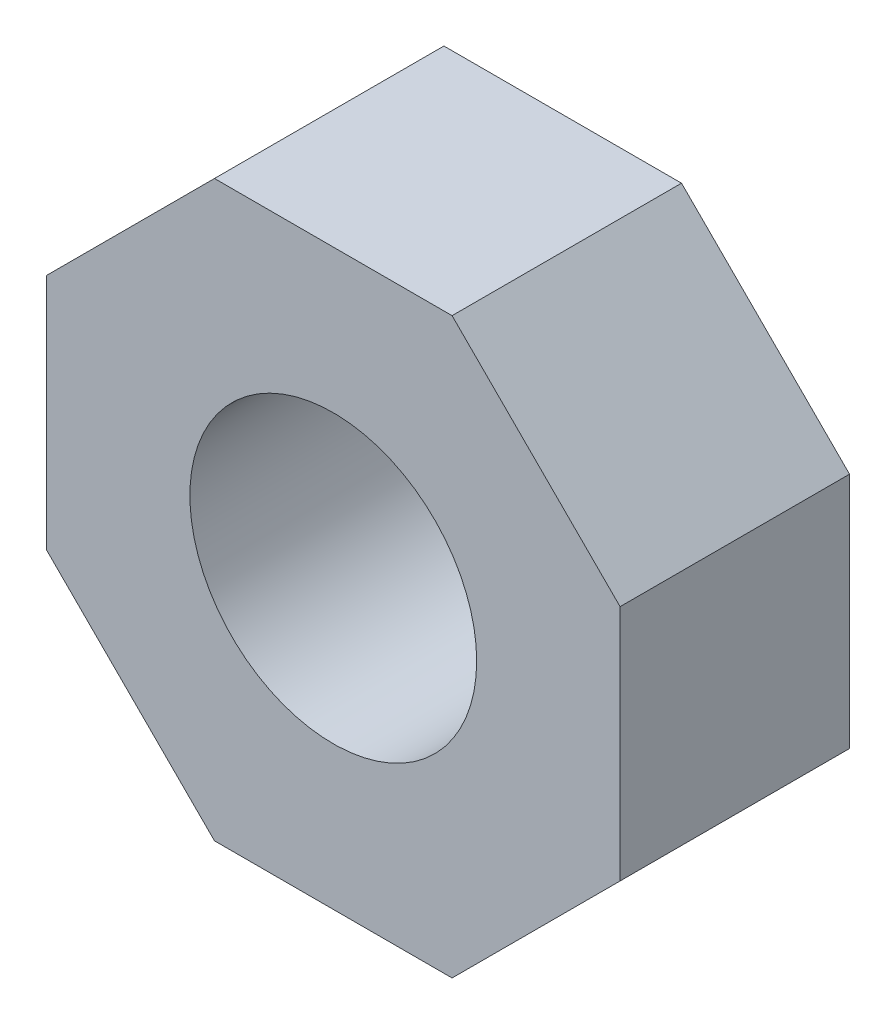
ISO-10303-21;
HEADER;
FILE_DESCRIPTION(('STEP AP214'),'2;1');
FILE_NAME('part.step','',(''),(''),'','','');
FILE_SCHEMA(('AUTOMOTIVE_DESIGN { 1 0 10303 214 1 1 1 1 }'));
ENDSEC;
DATA;
#1=APPLICATION_CONTEXT('core data for automotive mechanical design processes');
#2=APPLICATION_PROTOCOL_DEFINITION('international standard','automotive_design',2000,#1);
#3=PRODUCT_CONTEXT('',#1,'mechanical');
#4=PRODUCT('Part','Part','',(#3));
#5=PRODUCT_RELATED_PRODUCT_CATEGORY('part','',(#4));
#6=PRODUCT_DEFINITION_FORMATION('','',#4);
#7=PRODUCT_DEFINITION_CONTEXT('part definition',#1,'design');
#8=PRODUCT_DEFINITION('design','',#6,#7);
#9=PRODUCT_DEFINITION_SHAPE('','',#8);
#10=(LENGTH_UNIT() NAMED_UNIT(*) SI_UNIT(.MILLI.,.METRE.));
#11=(NAMED_UNIT(*) PLANE_ANGLE_UNIT() SI_UNIT($,.RADIAN.));
#12=(NAMED_UNIT(*) SI_UNIT($,.STERADIAN.) SOLID_ANGLE_UNIT());
#13=UNCERTAINTY_MEASURE_WITH_UNIT(LENGTH_MEASURE(1.E-05),#10,'distance_accuracy_value','');
#14=(GEOMETRIC_REPRESENTATION_CONTEXT(3) GLOBAL_UNCERTAINTY_ASSIGNED_CONTEXT((#13)) GLOBAL_UNIT_ASSIGNED_CONTEXT((#10,
#11,#12)) REPRESENTATION_CONTEXT('',''));
#15=CARTESIAN_POINT('',(0.,0.,0.));
#16=DIRECTION('',(0.,0.,1.));
#17=DIRECTION('',(1.,0.,0.));
#18=AXIS2_PLACEMENT_3D('',#15,#16,#17);
#19=CARTESIAN_POINT('',(-3.53553390593274,3.53553390593273,4.));
#20=DIRECTION('',(-0.707106781186549,0.707106781186546,0.));
#21=DIRECTION('',(-0.707106781186546,-0.707106781186549,0.));
#22=AXIS2_PLACEMENT_3D('',#19,#20,#21);
#23=PLANE('',#22);
#24=DIRECTION('',(0.707106781186546,0.707106781186549,0.));
#25=VECTOR('',#24,1.);
#26=CARTESIAN_POINT('',(-3.53553390593274,3.53553390593273,0.));
#27=LINE('',#26,#25);
#28=CARTESIAN_POINT('',(-4.99999999999999,2.07106781186546,0.));
#29=VERTEX_POINT('',#28);
#30=CARTESIAN_POINT('',(-2.07106781186548,5.,0.));
#31=VERTEX_POINT('',#30);
#32=EDGE_CURVE('E136',#29,#31,#27,.T.);
#33=ORIENTED_EDGE('',*,*,#32,.F.);
#34=DIRECTION('',(0.,0.,-1.));
#35=VECTOR('',#34,1.);
#36=CARTESIAN_POINT('',(-4.99999999999999,2.07106781186546,4.));
#37=LINE('',#36,#35);
#38=CARTESIAN_POINT('',(-4.99999999999999,2.07106781186546,4.));
#39=VERTEX_POINT('',#38);
#40=EDGE_CURVE('E11',#39,#29,#37,.T.);
#41=ORIENTED_EDGE('',*,*,#40,.F.);
#42=DIRECTION('',(0.707106781186546,0.707106781186549,0.));
#43=VECTOR('',#42,1.);
#44=CARTESIAN_POINT('',(-3.53553390593274,3.53553390593273,4.));
#45=LINE('',#44,#43);
#46=CARTESIAN_POINT('',(-2.07106781186548,5.,4.));
#47=VERTEX_POINT('',#46);
#48=EDGE_CURVE('E185',#39,#47,#45,.T.);
#49=ORIENTED_EDGE('',*,*,#48,.T.);
#50=DIRECTION('',(0.,0.,-1.));
#51=VECTOR('',#50,1.);
#52=CARTESIAN_POINT('',(-2.07106781186548,5.,4.));
#53=LINE('',#52,#51);
#54=EDGE_CURVE('E56',#47,#31,#53,.T.);
#55=ORIENTED_EDGE('',*,*,#54,.T.);
#56=EDGE_LOOP('',(#33,#41,#49,#55));
#57=FACE_BOUND('',#56,.T.);
#58=ADVANCED_FACE('F39',(#57),#23,.T.);
#59=CARTESIAN_POINT('',(-5.,0.,4.));
#60=DIRECTION('',(1.,0.,0.));
#61=DIRECTION('',(0.,1.,0.));
#62=AXIS2_PLACEMENT_3D('',#59,#60,#61);
#63=PLANE('',#62);
#64=DIRECTION('',(0.,-1.,0.));
#65=VECTOR('',#64,1.);
#66=CARTESIAN_POINT('',(-5.,0.,0.));
#67=LINE('',#66,#65);
#68=CARTESIAN_POINT('',(-4.99999999999999,-2.0710678118655,0.));
#69=VERTEX_POINT('',#68);
#70=EDGE_CURVE('E138',#29,#69,#67,.T.);
#71=ORIENTED_EDGE('',*,*,#70,.T.);
#72=DIRECTION('',(0.,0.,-1.));
#73=VECTOR('',#72,1.);
#74=CARTESIAN_POINT('',(-4.99999999999999,-2.0710678118655,4.));
#75=LINE('',#74,#73);
#76=CARTESIAN_POINT('',(-4.99999999999999,-2.0710678118655,4.));
#77=VERTEX_POINT('',#76);
#78=EDGE_CURVE('E48',#77,#69,#75,.T.);
#79=ORIENTED_EDGE('',*,*,#78,.F.);
#80=DIRECTION('',(0.,-1.,0.));
#81=VECTOR('',#80,1.);
#82=CARTESIAN_POINT('',(-5.,0.,4.));
#83=LINE('',#82,#81);
#84=EDGE_CURVE('E183',#39,#77,#83,.T.);
#85=ORIENTED_EDGE('',*,*,#84,.F.);
#86=ORIENTED_EDGE('',*,*,#40,.T.);
#87=EDGE_LOOP('',(#71,#79,#85,#86));
#88=FACE_BOUND('',#87,.T.);
#89=ADVANCED_FACE('F172',(#88),#63,.F.);
#90=CARTESIAN_POINT('',(-3.53553390593272,-3.53553390593276,4.));
#91=DIRECTION('',(-0.707106781186544,-0.707106781186551,0.));
#92=DIRECTION('',(0.707106781186551,-0.707106781186544,0.));
#93=AXIS2_PLACEMENT_3D('',#90,#91,#92);
#94=PLANE('',#93);
#95=DIRECTION('',(-0.707106781186551,0.707106781186544,0.));
#96=VECTOR('',#95,1.);
#97=CARTESIAN_POINT('',(-3.53553390593272,-3.53553390593276,0.));
#98=LINE('',#97,#96);
#99=CARTESIAN_POINT('',(-2.07106781186544,-5.,0.));
#100=VERTEX_POINT('',#99);
#101=EDGE_CURVE('E141',#100,#69,#98,.T.);
#102=ORIENTED_EDGE('',*,*,#101,.F.);
#103=DIRECTION('',(0.,0.,-1.));
#104=VECTOR('',#103,1.);
#105=CARTESIAN_POINT('',(-2.07106781186544,-5.,4.));
#106=LINE('',#105,#104);
#107=CARTESIAN_POINT('',(-2.07106781186544,-5.,4.));
#108=VERTEX_POINT('',#107);
#109=EDGE_CURVE('E162',#108,#100,#106,.T.);
#110=ORIENTED_EDGE('',*,*,#109,.F.);
#111=DIRECTION('',(-0.707106781186551,0.707106781186544,0.));
#112=VECTOR('',#111,1.);
#113=CARTESIAN_POINT('',(-3.53553390593272,-3.53553390593276,4.));
#114=LINE('',#113,#112);
#115=EDGE_CURVE('E169',#108,#77,#114,.T.);
#116=ORIENTED_EDGE('',*,*,#115,.T.);
#117=ORIENTED_EDGE('',*,*,#78,.T.);
#118=EDGE_LOOP('',(#102,#110,#116,#117));
#119=FACE_BOUND('',#118,.T.);
#120=ADVANCED_FACE('F167',(#119),#94,.T.);
#121=CARTESIAN_POINT('',(0.,-5.,4.));
#122=DIRECTION('',(0.,1.,0.));
#123=DIRECTION('',(-1.,0.,0.));
#124=AXIS2_PLACEMENT_3D('',#121,#122,#123);
#125=PLANE('',#124);
#126=DIRECTION('',(1.,0.,0.));
#127=VECTOR('',#126,1.);
#128=CARTESIAN_POINT('',(0.,-5.,0.));
#129=LINE('',#128,#127);
#130=CARTESIAN_POINT('',(2.07106781186548,-5.,0.));
#131=VERTEX_POINT('',#130);
#132=EDGE_CURVE('E144',#100,#131,#129,.T.);
#133=ORIENTED_EDGE('',*,*,#132,.T.);
#134=DIRECTION('',(0.,0.,-1.));
#135=VECTOR('',#134,1.);
#136=CARTESIAN_POINT('',(2.07106781186548,-5.,4.));
#137=LINE('',#136,#135);
#138=CARTESIAN_POINT('',(2.07106781186548,-5.,4.));
#139=VERTEX_POINT('',#138);
#140=EDGE_CURVE('E160',#139,#131,#137,.T.);
#141=ORIENTED_EDGE('',*,*,#140,.F.);
#142=DIRECTION('',(1.,0.,0.));
#143=VECTOR('',#142,1.);
#144=CARTESIAN_POINT('',(0.,-5.,4.));
#145=LINE('',#144,#143);
#146=EDGE_CURVE('E181',#108,#139,#145,.T.);
#147=ORIENTED_EDGE('',*,*,#146,.F.);
#148=ORIENTED_EDGE('',*,*,#109,.T.);
#149=EDGE_LOOP('',(#133,#141,#147,#148));
#150=FACE_BOUND('',#149,.T.);
#151=ADVANCED_FACE('F179',(#150),#125,.F.);
#152=CARTESIAN_POINT('',(3.53553390593274,-3.53553390593274,4.));
#153=DIRECTION('',(0.707106781186548,-0.707106781186547,0.));
#154=DIRECTION('',(0.707106781186547,0.707106781186548,0.));
#155=AXIS2_PLACEMENT_3D('',#152,#153,#154);
#156=PLANE('',#155);
#157=DIRECTION('',(-0.707106781186547,-0.707106781186548,0.));
#158=VECTOR('',#157,1.);
#159=CARTESIAN_POINT('',(3.53553390593274,-3.53553390593274,0.));
#160=LINE('',#159,#158);
#161=CARTESIAN_POINT('',(5.00000000000001,-2.07106781186546,0.));
#162=VERTEX_POINT('',#161);
#163=EDGE_CURVE('E147',#162,#131,#160,.T.);
#164=ORIENTED_EDGE('',*,*,#163,.F.);
#165=DIRECTION('',(0.,0.,-1.));
#166=VECTOR('',#165,1.);
#167=CARTESIAN_POINT('',(5.00000000000001,-2.07106781186546,4.));
#168=LINE('',#167,#166);
#169=CARTESIAN_POINT('',(5.00000000000001,-2.07106781186546,4.));
#170=VERTEX_POINT('',#169);
#171=EDGE_CURVE('E115',#170,#162,#168,.T.);
#172=ORIENTED_EDGE('',*,*,#171,.F.);
#173=DIRECTION('',(-0.707106781186547,-0.707106781186548,0.));
#174=VECTOR('',#173,1.);
#175=CARTESIAN_POINT('',(3.53553390593274,-3.53553390593274,4.));
#176=LINE('',#175,#174);
#177=EDGE_CURVE('E125',#170,#139,#176,.T.);
#178=ORIENTED_EDGE('',*,*,#177,.T.);
#179=ORIENTED_EDGE('',*,*,#140,.T.);
#180=EDGE_LOOP('',(#164,#172,#178,#179));
#181=FACE_BOUND('',#180,.T.);
#182=ADVANCED_FACE('F189',(#181),#156,.T.);
#183=CARTESIAN_POINT('',(5.00000000000001,0.,4.));
#184=DIRECTION('',(1.,0.,0.));
#185=DIRECTION('',(0.,1.,0.));
#186=AXIS2_PLACEMENT_3D('',#183,#184,#185);
#187=PLANE('',#186);
#188=DIRECTION('',(0.,-1.,0.));
#189=VECTOR('',#188,1.);
#190=CARTESIAN_POINT('',(5.00000000000001,0.,0.));
#191=LINE('',#190,#189);
#192=CARTESIAN_POINT('',(5.00000000000001,2.07106781186547,0.));
#193=VERTEX_POINT('',#192);
#194=EDGE_CURVE('E111',#193,#162,#191,.T.);
#195=ORIENTED_EDGE('',*,*,#194,.F.);
#196=DIRECTION('',(0.,0.,-1.));
#197=VECTOR('',#196,1.);
#198=CARTESIAN_POINT('',(5.00000000000001,2.07106781186547,4.));
#199=LINE('',#198,#197);
#200=CARTESIAN_POINT('',(5.00000000000001,2.07106781186547,4.));
#201=VERTEX_POINT('',#200);
#202=EDGE_CURVE('E106',#201,#193,#199,.T.);
#203=ORIENTED_EDGE('',*,*,#202,.F.);
#204=DIRECTION('',(0.,-1.,0.));
#205=VECTOR('',#204,1.);
#206=CARTESIAN_POINT('',(5.00000000000001,0.,4.));
#207=LINE('',#206,#205);
#208=EDGE_CURVE('E109',#201,#170,#207,.T.);
#209=ORIENTED_EDGE('',*,*,#208,.T.);
#210=ORIENTED_EDGE('',*,*,#171,.T.);
#211=EDGE_LOOP('',(#195,#203,#209,#210));
#212=FACE_BOUND('',#211,.T.);
#213=ADVANCED_FACE('F108',(#212),#187,.T.);
#214=CARTESIAN_POINT('',(3.53553390593274,3.53553390593274,4.));
#215=DIRECTION('',(0.707106781186547,0.707106781186548,0.));
#216=DIRECTION('',(-0.707106781186548,0.707106781186547,0.));
#217=AXIS2_PLACEMENT_3D('',#214,#215,#216);
#218=PLANE('',#217);
#219=DIRECTION('',(0.707106781186548,-0.707106781186547,0.));
#220=VECTOR('',#219,1.);
#221=CARTESIAN_POINT('',(3.53553390593274,3.53553390593274,0.));
#222=LINE('',#221,#220);
#223=CARTESIAN_POINT('',(2.07106781186547,5.,0.));
#224=VERTEX_POINT('',#223);
#225=EDGE_CURVE('E151',#224,#193,#222,.T.);
#226=ORIENTED_EDGE('',*,*,#225,.F.);
#227=DIRECTION('',(0.,0.,-1.));
#228=VECTOR('',#227,1.);
#229=CARTESIAN_POINT('',(2.07106781186547,5.,4.));
#230=LINE('',#229,#228);
#231=CARTESIAN_POINT('',(2.07106781186547,5.,4.));
#232=VERTEX_POINT('',#231);
#233=EDGE_CURVE('E81',#232,#224,#230,.T.);
#234=ORIENTED_EDGE('',*,*,#233,.F.);
#235=DIRECTION('',(0.707106781186548,-0.707106781186547,0.));
#236=VECTOR('',#235,1.);
#237=CARTESIAN_POINT('',(3.53553390593274,3.53553390593274,4.));
#238=LINE('',#237,#236);
#239=EDGE_CURVE('E123',#232,#201,#238,.T.);
#240=ORIENTED_EDGE('',*,*,#239,.T.);
#241=ORIENTED_EDGE('',*,*,#202,.T.);
#242=EDGE_LOOP('',(#226,#234,#240,#241));
#243=FACE_BOUND('',#242,.T.);
#244=ADVANCED_FACE('F127',(#243),#218,.T.);
#245=CARTESIAN_POINT('',(0.,0.,4.));
#246=DIRECTION('',(0.,0.,-1.));
#247=DIRECTION('',(-1.,0.,0.));
#248=AXIS2_PLACEMENT_3D('',#245,#246,#247);
#249=CYLINDRICAL_SURFACE('',#248,2.5);
#250=CARTESIAN_POINT('',(0.,0.,4.));
#251=DIRECTION('',(0.,0.,1.));
#252=DIRECTION('',(1.,0.,0.));
#253=AXIS2_PLACEMENT_3D('',#250,#251,#252);
#254=CIRCLE('',#253,2.5);
#255=CARTESIAN_POINT('',(2.5,0.,4.));
#256=VERTEX_POINT('',#255);
#257=EDGE_CURVE('E156',#256,#256,#254,.T.);
#258=ORIENTED_EDGE('',*,*,#257,.T.);
#259=EDGE_LOOP('',(#258));
#260=FACE_BOUND('',#259,.T.);
#261=CARTESIAN_POINT('',(0.,0.,0.));
#262=DIRECTION('',(0.,0.,1.));
#263=DIRECTION('',(1.,0.,0.));
#264=AXIS2_PLACEMENT_3D('',#261,#262,#263);
#265=CIRCLE('',#264,2.5);
#266=CARTESIAN_POINT('',(2.5,0.,0.));
#267=VERTEX_POINT('',#266);
#268=EDGE_CURVE('E133',#267,#267,#265,.T.);
#269=ORIENTED_EDGE('',*,*,#268,.F.);
#270=EDGE_LOOP('',(#269));
#271=FACE_BOUND('',#270,.T.);
#272=ADVANCED_FACE('F41',(#260,#271),#249,.F.);
#273=CARTESIAN_POINT('',(0.,5.,4.));
#274=DIRECTION('',(0.,1.,0.));
#275=DIRECTION('',(-1.,0.,0.));
#276=AXIS2_PLACEMENT_3D('',#273,#274,#275);
#277=PLANE('',#276);
#278=DIRECTION('',(1.,0.,0.));
#279=VECTOR('',#278,1.);
#280=CARTESIAN_POINT('',(0.,5.,0.));
#281=LINE('',#280,#279);
#282=EDGE_CURVE('E153',#31,#224,#281,.T.);
#283=ORIENTED_EDGE('',*,*,#282,.F.);
#284=ORIENTED_EDGE('',*,*,#54,.F.);
#285=DIRECTION('',(1.,0.,0.));
#286=VECTOR('',#285,1.);
#287=CARTESIAN_POINT('',(0.,5.,4.));
#288=LINE('',#287,#286);
#289=EDGE_CURVE('E128',#47,#232,#288,.T.);
#290=ORIENTED_EDGE('',*,*,#289,.T.);
#291=ORIENTED_EDGE('',*,*,#233,.T.);
#292=EDGE_LOOP('',(#283,#284,#290,#291));
#293=FACE_BOUND('',#292,.T.);
#294=ADVANCED_FACE('F190',(#293),#277,.T.);
#295=CARTESIAN_POINT('',(0.,0.,4.));
#296=DIRECTION('',(0.,0.,1.));
#297=DIRECTION('',(1.,0.,0.));
#298=AXIS2_PLACEMENT_3D('',#295,#296,#297);
#299=PLANE('',#298);
#300=ORIENTED_EDGE('',*,*,#257,.F.);
#301=EDGE_LOOP('',(#300));
#302=FACE_BOUND('',#301,.T.);
#303=ORIENTED_EDGE('',*,*,#48,.F.);
#304=ORIENTED_EDGE('',*,*,#84,.T.);
#305=ORIENTED_EDGE('',*,*,#115,.F.);
#306=ORIENTED_EDGE('',*,*,#146,.T.);
#307=ORIENTED_EDGE('',*,*,#177,.F.);
#308=ORIENTED_EDGE('',*,*,#208,.F.);
#309=ORIENTED_EDGE('',*,*,#239,.F.);
#310=ORIENTED_EDGE('',*,*,#289,.F.);
#311=EDGE_LOOP('',(#303,#304,#305,#306,#307,#308,#309,#310));
#312=FACE_BOUND('',#311,.T.);
#313=ADVANCED_FACE('F121',(#302,#312),#299,.T.);
#314=CARTESIAN_POINT('',(0.,0.,0.));
#315=DIRECTION('',(0.,0.,1.));
#316=DIRECTION('',(1.,0.,0.));
#317=AXIS2_PLACEMENT_3D('',#314,#315,#316);
#318=PLANE('',#317);
#319=ORIENTED_EDGE('',*,*,#268,.T.);
#320=EDGE_LOOP('',(#319));
#321=FACE_BOUND('',#320,.T.);
#322=ORIENTED_EDGE('',*,*,#32,.T.);
#323=ORIENTED_EDGE('',*,*,#282,.T.);
#324=ORIENTED_EDGE('',*,*,#225,.T.);
#325=ORIENTED_EDGE('',*,*,#194,.T.);
#326=ORIENTED_EDGE('',*,*,#163,.T.);
#327=ORIENTED_EDGE('',*,*,#132,.F.);
#328=ORIENTED_EDGE('',*,*,#101,.T.);
#329=ORIENTED_EDGE('',*,*,#70,.F.);
#330=EDGE_LOOP('',(#322,#323,#324,#325,#326,#327,#328,#329));
#331=FACE_BOUND('',#330,.T.);
#332=ADVANCED_FACE('F175',(#321,#331),#318,.F.);
#333=CLOSED_SHELL('',(#58,#89,#120,#151,#182,#213,#244,#272,#294,#313,#332));
#334=MANIFOLD_SOLID_BREP('B2',#333);
#335=ADVANCED_BREP_SHAPE_REPRESENTATION('',(#18,#334),#14);
#336=SHAPE_DEFINITION_REPRESENTATION(#9,#335);
ENDSEC;
END-ISO-10303-21;
